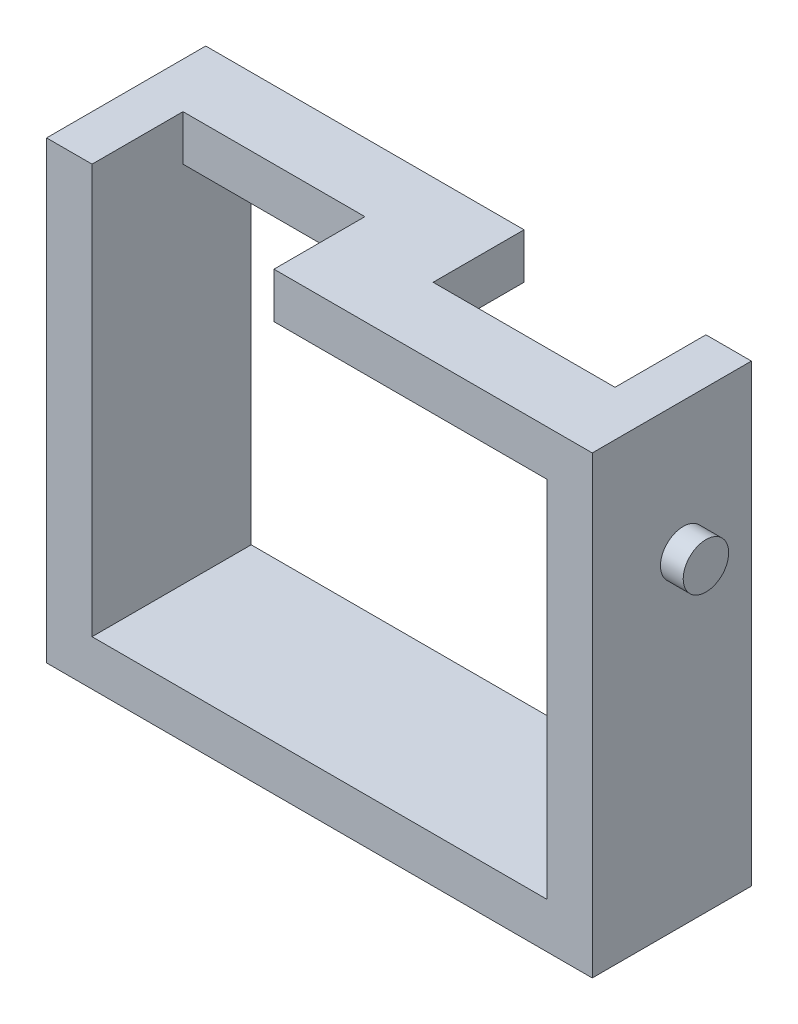
ISO-10303-21;
HEADER;
FILE_DESCRIPTION(('STEP AP214'),'2;1');
FILE_NAME('part.step','',(''),(''),'','','');
FILE_SCHEMA(('AUTOMOTIVE_DESIGN { 1 0 10303 214 1 1 1 1 }'));
ENDSEC;
DATA;
#1=APPLICATION_CONTEXT('core data for automotive mechanical design processes');
#2=APPLICATION_PROTOCOL_DEFINITION('international standard','automotive_design',2000,#1);
#3=PRODUCT_CONTEXT('',#1,'mechanical');
#4=PRODUCT('Part','Part','',(#3));
#5=PRODUCT_RELATED_PRODUCT_CATEGORY('part','',(#4));
#6=PRODUCT_DEFINITION_FORMATION('','',#4);
#7=PRODUCT_DEFINITION_CONTEXT('part definition',#1,'design');
#8=PRODUCT_DEFINITION('design','',#6,#7);
#9=PRODUCT_DEFINITION_SHAPE('','',#8);
#10=(LENGTH_UNIT() NAMED_UNIT(*) SI_UNIT(.MILLI.,.METRE.));
#11=(NAMED_UNIT(*) PLANE_ANGLE_UNIT() SI_UNIT($,.RADIAN.));
#12=(NAMED_UNIT(*) SI_UNIT($,.STERADIAN.) SOLID_ANGLE_UNIT());
#13=UNCERTAINTY_MEASURE_WITH_UNIT(LENGTH_MEASURE(1.E-05),#10,'distance_accuracy_value','');
#14=(GEOMETRIC_REPRESENTATION_CONTEXT(3) GLOBAL_UNCERTAINTY_ASSIGNED_CONTEXT((#13)) GLOBAL_UNIT_ASSIGNED_CONTEXT((#10,
#11,#12)) REPRESENTATION_CONTEXT('',''));
#15=CARTESIAN_POINT('',(0.,0.,0.));
#16=DIRECTION('',(0.,0.,1.));
#17=DIRECTION('',(1.,0.,0.));
#18=AXIS2_PLACEMENT_3D('',#15,#16,#17);
#19=CARTESIAN_POINT('',(-26.9852941176471,14.1544117647059,30.));
#20=DIRECTION('',(1.,0.,0.));
#21=DIRECTION('',(0.,1.,0.));
#22=AXIS2_PLACEMENT_3D('',#19,#20,#21);
#23=PLANE('',#22);
#24=CARTESIAN_POINT('',(-26.9852941176471,-0.345588235294112,20.));
#25=DIRECTION('',(1.,0.,0.));
#26=DIRECTION('',(0.,1.,0.));
#27=AXIS2_PLACEMENT_3D('',#24,#25,#26);
#28=CIRCLE('',#27,2.5);
#29=CARTESIAN_POINT('',(-26.9852941176471,2.15441176470589,20.));
#30=VERTEX_POINT('',#29);
#31=EDGE_CURVE('E11',#30,#30,#28,.F.);
#32=ORIENTED_EDGE('',*,*,#31,.F.);
#33=EDGE_LOOP('',(#32));
#34=FACE_BOUND('',#33,.T.);
#35=DIRECTION('',(0.,0.,-1.));
#36=VECTOR('',#35,1.);
#37=CARTESIAN_POINT('',(-26.9852941176471,14.1544117647059,30.));
#38=LINE('',#37,#36);
#39=CARTESIAN_POINT('',(-26.9852941176471,14.1544117647059,30.));
#40=VERTEX_POINT('',#39);
#41=CARTESIAN_POINT('',(-26.9852941176471,14.1544117647059,12.5));
#42=VERTEX_POINT('',#41);
#43=EDGE_CURVE('E156',#40,#42,#38,.T.);
#44=ORIENTED_EDGE('',*,*,#43,.T.);
#45=DIRECTION('',(0.,-1.,0.));
#46=VECTOR('',#45,1.);
#47=CARTESIAN_POINT('',(-26.9852941176471,14.1544117647059,12.5));
#48=LINE('',#47,#46);
#49=CARTESIAN_POINT('',(-26.9852941176471,-35.8455882352941,12.5));
#50=VERTEX_POINT('',#49);
#51=EDGE_CURVE('E138',#42,#50,#48,.T.);
#52=ORIENTED_EDGE('',*,*,#51,.T.);
#53=DIRECTION('',(0.,0.,-1.));
#54=VECTOR('',#53,1.);
#55=CARTESIAN_POINT('',(-26.9852941176471,-35.8455882352941,30.));
#56=LINE('',#55,#54);
#57=CARTESIAN_POINT('',(-26.9852941176471,-35.8455882352941,30.));
#58=VERTEX_POINT('',#57);
#59=EDGE_CURVE('E181',#58,#50,#56,.T.);
#60=ORIENTED_EDGE('',*,*,#59,.F.);
#61=DIRECTION('',(0.,-1.,0.));
#62=VECTOR('',#61,1.);
#63=CARTESIAN_POINT('',(-26.9852941176471,14.1544117647059,30.));
#64=LINE('',#63,#62);
#65=EDGE_CURVE('E164',#40,#58,#64,.T.);
#66=ORIENTED_EDGE('',*,*,#65,.F.);
#67=EDGE_LOOP('',(#44,#52,#60,#66));
#68=FACE_BOUND('',#67,.T.);
#69=ADVANCED_FACE('F39',(#34,#68),#23,.F.);
#70=CARTESIAN_POINT('',(-26.9852941176471,-35.8455882352941,30.));
#71=DIRECTION('',(0.,1.,0.));
#72=DIRECTION('',(0.,0.,1.));
#73=AXIS2_PLACEMENT_3D('',#70,#71,#72);
#74=PLANE('',#73);
#75=ORIENTED_EDGE('',*,*,#59,.T.);
#76=DIRECTION('',(1.,0.,0.));
#77=VECTOR('',#76,1.);
#78=CARTESIAN_POINT('',(-28.3531366312246,-35.8455882352941,12.5));
#79=LINE('',#78,#77);
#80=CARTESIAN_POINT('',(33.0147058823529,-35.8455882352941,12.5));
#81=VERTEX_POINT('',#80);
#82=EDGE_CURVE('E141',#50,#81,#79,.T.);
#83=ORIENTED_EDGE('',*,*,#82,.T.);
#84=DIRECTION('',(0.,0.,-1.));
#85=VECTOR('',#84,1.);
#86=CARTESIAN_POINT('',(33.0147058823529,-35.8455882352941,30.));
#87=LINE('',#86,#85);
#88=CARTESIAN_POINT('',(33.0147058823529,-35.8455882352941,30.));
#89=VERTEX_POINT('',#88);
#90=EDGE_CURVE('E171',#89,#81,#87,.T.);
#91=ORIENTED_EDGE('',*,*,#90,.F.);
#92=DIRECTION('',(1.,0.,0.));
#93=VECTOR('',#92,1.);
#94=CARTESIAN_POINT('',(-26.9852941176471,-35.8455882352941,30.));
#95=LINE('',#94,#93);
#96=EDGE_CURVE('E211',#58,#89,#95,.T.);
#97=ORIENTED_EDGE('',*,*,#96,.F.);
#98=EDGE_LOOP('',(#75,#83,#91,#97));
#99=FACE_BOUND('',#98,.T.);
#100=ADVANCED_FACE('F203',(#99),#74,.F.);
#101=CARTESIAN_POINT('',(33.0147058823529,14.1544117647059,30.));
#102=DIRECTION('',(-1.,0.,0.));
#103=DIRECTION('',(0.,0.,1.));
#104=AXIS2_PLACEMENT_3D('',#101,#102,#103);
#105=PLANE('',#104);
#106=CARTESIAN_POINT('',(33.0147058823529,-0.345588235294111,20.));
#107=DIRECTION('',(-1.,0.,0.));
#108=DIRECTION('',(0.,0.,1.));
#109=AXIS2_PLACEMENT_3D('',#106,#107,#108);
#110=CIRCLE('',#109,2.5);
#111=CARTESIAN_POINT('',(33.0147058823529,-0.345588235294111,22.5));
#112=VERTEX_POINT('',#111);
#113=EDGE_CURVE('E47',#112,#112,#110,.F.);
#114=ORIENTED_EDGE('',*,*,#113,.F.);
#115=EDGE_LOOP('',(#114));
#116=FACE_BOUND('',#115,.T.);
#117=ORIENTED_EDGE('',*,*,#90,.T.);
#118=DIRECTION('',(0.,1.,0.));
#119=VECTOR('',#118,1.);
#120=CARTESIAN_POINT('',(33.0147058823529,14.1544117647059,12.5));
#121=LINE('',#120,#119);
#122=CARTESIAN_POINT('',(33.0147058823529,14.1544117647059,12.5));
#123=VERTEX_POINT('',#122);
#124=EDGE_CURVE('E148',#81,#123,#121,.T.);
#125=ORIENTED_EDGE('',*,*,#124,.T.);
#126=DIRECTION('',(0.,0.,-1.));
#127=VECTOR('',#126,1.);
#128=CARTESIAN_POINT('',(33.0147058823529,14.1544117647059,30.));
#129=LINE('',#128,#127);
#130=CARTESIAN_POINT('',(33.0147058823529,14.1544117647059,30.));
#131=VERTEX_POINT('',#130);
#132=EDGE_CURVE('E166',#131,#123,#129,.T.);
#133=ORIENTED_EDGE('',*,*,#132,.F.);
#134=DIRECTION('',(0.,1.,0.));
#135=VECTOR('',#134,1.);
#136=CARTESIAN_POINT('',(33.0147058823529,14.1544117647059,30.));
#137=LINE('',#136,#135);
#138=EDGE_CURVE('E209',#89,#131,#137,.T.);
#139=ORIENTED_EDGE('',*,*,#138,.F.);
#140=EDGE_LOOP('',(#117,#125,#133,#139));
#141=FACE_BOUND('',#140,.T.);
#142=ADVANCED_FACE('F200',(#116,#141),#105,.F.);
#143=CARTESIAN_POINT('',(-26.9852941176471,14.1544117647059,30.));
#144=DIRECTION('',(0.,-1.,0.));
#145=DIRECTION('',(0.,0.,-1.));
#146=AXIS2_PLACEMENT_3D('',#143,#144,#145);
#147=PLANE('',#146);
#148=ORIENTED_EDGE('',*,*,#132,.T.);
#149=DIRECTION('',(1.,0.,0.));
#150=VECTOR('',#149,1.);
#151=CARTESIAN_POINT('',(-28.3531366312246,14.1544117647059,12.5));
#152=LINE('',#151,#150);
#153=CARTESIAN_POINT('',(28.0147058823529,14.1544117647059,12.5));
#154=VERTEX_POINT('',#153);
#155=EDGE_CURVE('E161',#154,#123,#152,.T.);
#156=ORIENTED_EDGE('',*,*,#155,.F.);
#157=DIRECTION('',(0.,0.,-1.));
#158=VECTOR('',#157,1.);
#159=CARTESIAN_POINT('',(28.0147058823529,14.1544117647059,0.));
#160=LINE('',#159,#158);
#161=CARTESIAN_POINT('',(28.0147058823529,14.1544117647059,22.5));
#162=VERTEX_POINT('',#161);
#163=EDGE_CURVE('E259',#162,#154,#160,.T.);
#164=ORIENTED_EDGE('',*,*,#163,.F.);
#165=DIRECTION('',(1.,0.,0.));
#166=VECTOR('',#165,1.);
#167=CARTESIAN_POINT('',(8.01470588235294,14.1544117647059,22.5));
#168=LINE('',#167,#166);
#169=CARTESIAN_POINT('',(8.01470588235294,14.1544117647059,22.5));
#170=VERTEX_POINT('',#169);
#171=EDGE_CURVE('E266',#170,#162,#168,.T.);
#172=ORIENTED_EDGE('',*,*,#171,.F.);
#173=DIRECTION('',(0.,0.,1.));
#174=VECTOR('',#173,1.);
#175=CARTESIAN_POINT('',(8.01470588235294,14.1544117647059,0.));
#176=LINE('',#175,#174);
#177=CARTESIAN_POINT('',(8.01470588235294,14.1544117647059,12.5));
#178=VERTEX_POINT('',#177);
#179=EDGE_CURVE('E159',#178,#170,#176,.T.);
#180=ORIENTED_EDGE('',*,*,#179,.F.);
#181=EDGE_CURVE('E54',#42,#178,#152,.T.);
#182=ORIENTED_EDGE('',*,*,#181,.F.);
#183=ORIENTED_EDGE('',*,*,#43,.F.);
#184=DIRECTION('',(-1.,0.,0.));
#185=VECTOR('',#184,1.);
#186=CARTESIAN_POINT('',(-26.9852941176471,14.1544117647059,30.));
#187=LINE('',#186,#185);
#188=CARTESIAN_POINT('',(-21.9852941176471,14.1544117647059,30.));
#189=VERTEX_POINT('',#188);
#190=EDGE_CURVE('E174',#189,#40,#187,.T.);
#191=ORIENTED_EDGE('',*,*,#190,.F.);
#192=DIRECTION('',(0.,0.,1.));
#193=VECTOR('',#192,1.);
#194=CARTESIAN_POINT('',(-21.9852941176471,14.1544117647059,30.));
#195=LINE('',#194,#193);
#196=CARTESIAN_POINT('',(-21.9852941176471,14.1544117647059,20.));
#197=VERTEX_POINT('',#196);
#198=EDGE_CURVE('E147',#197,#189,#195,.T.);
#199=ORIENTED_EDGE('',*,*,#198,.F.);
#200=DIRECTION('',(-1.,0.,0.));
#201=VECTOR('',#200,1.);
#202=CARTESIAN_POINT('',(-21.9852941176471,14.1544117647059,20.));
#203=LINE('',#202,#201);
#204=CARTESIAN_POINT('',(-1.98529411764706,14.1544117647059,20.));
#205=VERTEX_POINT('',#204);
#206=EDGE_CURVE('E243',#205,#197,#203,.T.);
#207=ORIENTED_EDGE('',*,*,#206,.F.);
#208=DIRECTION('',(0.,0.,-1.));
#209=VECTOR('',#208,1.);
#210=CARTESIAN_POINT('',(-1.98529411764706,14.1544117647059,30.));
#211=LINE('',#210,#209);
#212=CARTESIAN_POINT('',(-1.98529411764706,14.1544117647059,30.));
#213=VERTEX_POINT('',#212);
#214=EDGE_CURVE('E240',#213,#205,#211,.T.);
#215=ORIENTED_EDGE('',*,*,#214,.F.);
#216=EDGE_CURVE('E167',#131,#213,#187,.T.);
#217=ORIENTED_EDGE('',*,*,#216,.F.);
#218=EDGE_LOOP('',(#148,#156,#164,#172,#180,#182,#183,#191,#199,#207,#215,#217));
#219=FACE_BOUND('',#218,.T.);
#220=ADVANCED_FACE('F154',(#219),#147,.F.);
#221=CARTESIAN_POINT('',(0.,0.,30.));
#222=DIRECTION('',(0.,0.,1.));
#223=DIRECTION('',(1.,0.,0.));
#224=AXIS2_PLACEMENT_3D('',#221,#222,#223);
#225=PLANE('',#224);
#226=DIRECTION('',(0.,-1.,0.));
#227=VECTOR('',#226,1.);
#228=CARTESIAN_POINT('',(-21.9852941176471,9.15441176470589,30.));
#229=LINE('',#228,#227);
#230=CARTESIAN_POINT('',(-21.9852941176471,-30.8455882352941,30.));
#231=VERTEX_POINT('',#230);
#232=EDGE_CURVE('E276',#189,#231,#229,.T.);
#233=ORIENTED_EDGE('',*,*,#232,.F.);
#234=ORIENTED_EDGE('',*,*,#190,.T.);
#235=ORIENTED_EDGE('',*,*,#65,.T.);
#236=ORIENTED_EDGE('',*,*,#96,.T.);
#237=ORIENTED_EDGE('',*,*,#138,.T.);
#238=ORIENTED_EDGE('',*,*,#216,.T.);
#239=DIRECTION('',(0.,1.,0.));
#240=VECTOR('',#239,1.);
#241=CARTESIAN_POINT('',(-1.98529411764706,4.15441176470589,30.));
#242=LINE('',#241,#240);
#243=CARTESIAN_POINT('',(-1.98529411764706,9.15441176470589,30.));
#244=VERTEX_POINT('',#243);
#245=EDGE_CURVE('E247',#244,#213,#242,.T.);
#246=ORIENTED_EDGE('',*,*,#245,.F.);
#247=DIRECTION('',(-1.,0.,0.));
#248=VECTOR('',#247,1.);
#249=CARTESIAN_POINT('',(-21.9852941176471,9.15441176470589,30.));
#250=LINE('',#249,#248);
#251=CARTESIAN_POINT('',(28.0147058823529,9.15441176470589,30.));
#252=VERTEX_POINT('',#251);
#253=EDGE_CURVE('E291',#252,#244,#250,.T.);
#254=ORIENTED_EDGE('',*,*,#253,.F.);
#255=DIRECTION('',(0.,1.,0.));
#256=VECTOR('',#255,1.);
#257=CARTESIAN_POINT('',(28.0147058823529,9.15441176470589,30.));
#258=LINE('',#257,#256);
#259=CARTESIAN_POINT('',(28.014705882353,-30.8455882352941,30.));
#260=VERTEX_POINT('',#259);
#261=EDGE_CURVE('E287',#260,#252,#258,.T.);
#262=ORIENTED_EDGE('',*,*,#261,.F.);
#263=DIRECTION('',(1.,0.,0.));
#264=VECTOR('',#263,1.);
#265=CARTESIAN_POINT('',(-21.9852941176471,-30.8455882352941,30.));
#266=LINE('',#265,#264);
#267=EDGE_CURVE('E283',#231,#260,#266,.T.);
#268=ORIENTED_EDGE('',*,*,#267,.F.);
#269=EDGE_LOOP('',(#233,#234,#235,#236,#237,#238,#246,#254,#262,#268));
#270=FACE_BOUND('',#269,.T.);
#271=ADVANCED_FACE('F313',(#270),#225,.T.);
#272=CARTESIAN_POINT('',(-21.9852941176471,9.15441176470589,0.));
#273=DIRECTION('',(-1.,0.,0.));
#274=DIRECTION('',(0.,-1.,0.));
#275=AXIS2_PLACEMENT_3D('',#272,#273,#274);
#276=PLANE('',#275);
#277=DIRECTION('',(0.,0.,1.));
#278=VECTOR('',#277,1.);
#279=CARTESIAN_POINT('',(-21.9852941176471,-30.8455882352941,0.));
#280=LINE('',#279,#278);
#281=CARTESIAN_POINT('',(-21.9852941176471,-30.8455882352941,12.5));
#282=VERTEX_POINT('',#281);
#283=EDGE_CURVE('E295',#282,#231,#280,.T.);
#284=ORIENTED_EDGE('',*,*,#283,.F.);
#285=DIRECTION('',(0.,1.,0.));
#286=VECTOR('',#285,1.);
#287=CARTESIAN_POINT('',(-21.9852941176471,9.15441176470589,12.5));
#288=LINE('',#287,#286);
#289=CARTESIAN_POINT('',(-21.9852941176471,9.15441176470589,12.5));
#290=VERTEX_POINT('',#289);
#291=EDGE_CURVE('E217',#282,#290,#288,.T.);
#292=ORIENTED_EDGE('',*,*,#291,.T.);
#293=DIRECTION('',(0.,0.,1.));
#294=VECTOR('',#293,1.);
#295=CARTESIAN_POINT('',(-21.9852941176471,9.15441176470589,0.));
#296=LINE('',#295,#294);
#297=CARTESIAN_POINT('',(-21.9852941176471,9.15441176470589,20.));
#298=VERTEX_POINT('',#297);
#299=EDGE_CURVE('E296',#290,#298,#296,.T.);
#300=ORIENTED_EDGE('',*,*,#299,.T.);
#301=DIRECTION('',(0.,1.,0.));
#302=VECTOR('',#301,1.);
#303=CARTESIAN_POINT('',(-21.9852941176471,4.15441176470589,20.));
#304=LINE('',#303,#302);
#305=EDGE_CURVE('E248',#298,#197,#304,.T.);
#306=ORIENTED_EDGE('',*,*,#305,.T.);
#307=ORIENTED_EDGE('',*,*,#198,.T.);
#308=ORIENTED_EDGE('',*,*,#232,.T.);
#309=EDGE_LOOP('',(#284,#292,#300,#306,#307,#308));
#310=FACE_BOUND('',#309,.T.);
#311=ADVANCED_FACE('F320',(#310),#276,.F.);
#312=CARTESIAN_POINT('',(-21.9852941176471,9.15441176470589,0.));
#313=DIRECTION('',(0.,1.,0.));
#314=DIRECTION('',(0.,0.,1.));
#315=AXIS2_PLACEMENT_3D('',#312,#313,#314);
#316=PLANE('',#315);
#317=ORIENTED_EDGE('',*,*,#299,.F.);
#318=DIRECTION('',(1.,0.,0.));
#319=VECTOR('',#318,1.);
#320=CARTESIAN_POINT('',(-21.9852941176471,9.15441176470589,12.5));
#321=LINE('',#320,#319);
#322=CARTESIAN_POINT('',(8.01470588235294,9.15441176470589,12.5));
#323=VERTEX_POINT('',#322);
#324=EDGE_CURVE('E213',#290,#323,#321,.T.);
#325=ORIENTED_EDGE('',*,*,#324,.T.);
#326=DIRECTION('',(0.,0.,1.));
#327=VECTOR('',#326,1.);
#328=CARTESIAN_POINT('',(8.01470588235294,9.15441176470589,0.));
#329=LINE('',#328,#327);
#330=CARTESIAN_POINT('',(8.01470588235294,9.15441176470589,22.5));
#331=VERTEX_POINT('',#330);
#332=EDGE_CURVE('E255',#323,#331,#329,.T.);
#333=ORIENTED_EDGE('',*,*,#332,.T.);
#334=DIRECTION('',(1.,0.,0.));
#335=VECTOR('',#334,1.);
#336=CARTESIAN_POINT('',(8.01470588235294,9.15441176470589,22.5));
#337=LINE('',#336,#335);
#338=CARTESIAN_POINT('',(28.0147058823529,9.15441176470589,22.5));
#339=VERTEX_POINT('',#338);
#340=EDGE_CURVE('E258',#331,#339,#337,.T.);
#341=ORIENTED_EDGE('',*,*,#340,.T.);
#342=DIRECTION('',(0.,0.,1.));
#343=VECTOR('',#342,1.);
#344=CARTESIAN_POINT('',(28.0147058823529,9.15441176470589,0.));
#345=LINE('',#344,#343);
#346=EDGE_CURVE('E299',#339,#252,#345,.T.);
#347=ORIENTED_EDGE('',*,*,#346,.T.);
#348=ORIENTED_EDGE('',*,*,#253,.T.);
#349=DIRECTION('',(0.,0.,-1.));
#350=VECTOR('',#349,1.);
#351=CARTESIAN_POINT('',(-1.98529411764706,9.15441176470589,0.));
#352=LINE('',#351,#350);
#353=CARTESIAN_POINT('',(-1.98529411764706,9.15441176470589,20.));
#354=VERTEX_POINT('',#353);
#355=EDGE_CURVE('E184',#244,#354,#352,.T.);
#356=ORIENTED_EDGE('',*,*,#355,.T.);
#357=DIRECTION('',(-1.,0.,0.));
#358=VECTOR('',#357,1.);
#359=CARTESIAN_POINT('',(-21.9852941176471,9.15441176470589,20.));
#360=LINE('',#359,#358);
#361=EDGE_CURVE('E188',#354,#298,#360,.T.);
#362=ORIENTED_EDGE('',*,*,#361,.T.);
#363=EDGE_LOOP('',(#317,#325,#333,#341,#347,#348,#356,#362));
#364=FACE_BOUND('',#363,.T.);
#365=ADVANCED_FACE('F331',(#364),#316,.F.);
#366=CARTESIAN_POINT('',(28.0147058823529,9.15441176470589,0.));
#367=DIRECTION('',(1.,0.,0.));
#368=DIRECTION('',(0.,1.,0.));
#369=AXIS2_PLACEMENT_3D('',#366,#367,#368);
#370=PLANE('',#369);
#371=ORIENTED_EDGE('',*,*,#163,.T.);
#372=DIRECTION('',(0.,-1.,0.));
#373=VECTOR('',#372,1.);
#374=CARTESIAN_POINT('',(28.0147058823529,9.15441176470589,12.5));
#375=LINE('',#374,#373);
#376=CARTESIAN_POINT('',(28.014705882353,-30.8455882352941,12.5));
#377=VERTEX_POINT('',#376);
#378=EDGE_CURVE('E231',#154,#377,#375,.T.);
#379=ORIENTED_EDGE('',*,*,#378,.T.);
#380=DIRECTION('',(0.,0.,1.));
#381=VECTOR('',#380,1.);
#382=CARTESIAN_POINT('',(28.014705882353,-30.8455882352941,0.));
#383=LINE('',#382,#381);
#384=EDGE_CURVE('E302',#377,#260,#383,.T.);
#385=ORIENTED_EDGE('',*,*,#384,.T.);
#386=ORIENTED_EDGE('',*,*,#261,.T.);
#387=ORIENTED_EDGE('',*,*,#346,.F.);
#388=DIRECTION('',(0.,1.,0.));
#389=VECTOR('',#388,1.);
#390=CARTESIAN_POINT('',(28.0147058823529,9.15441176470589,22.5));
#391=LINE('',#390,#389);
#392=EDGE_CURVE('E273',#339,#162,#391,.T.);
#393=ORIENTED_EDGE('',*,*,#392,.T.);
#394=EDGE_LOOP('',(#371,#379,#385,#386,#387,#393));
#395=FACE_BOUND('',#394,.T.);
#396=ADVANCED_FACE('F335',(#395),#370,.F.);
#397=CARTESIAN_POINT('',(-21.9852941176471,-30.8455882352941,0.));
#398=DIRECTION('',(0.,-1.,0.));
#399=DIRECTION('',(1.,0.,0.));
#400=AXIS2_PLACEMENT_3D('',#397,#398,#399);
#401=PLANE('',#400);
#402=ORIENTED_EDGE('',*,*,#384,.F.);
#403=DIRECTION('',(-1.,0.,0.));
#404=VECTOR('',#403,1.);
#405=CARTESIAN_POINT('',(-21.9852941176471,-30.8455882352941,12.5));
#406=LINE('',#405,#404);
#407=EDGE_CURVE('E227',#377,#282,#406,.T.);
#408=ORIENTED_EDGE('',*,*,#407,.T.);
#409=ORIENTED_EDGE('',*,*,#283,.T.);
#410=ORIENTED_EDGE('',*,*,#267,.T.);
#411=EDGE_LOOP('',(#402,#408,#409,#410));
#412=FACE_BOUND('',#411,.T.);
#413=ADVANCED_FACE('F338',(#412),#401,.F.);
#414=CARTESIAN_POINT('',(8.01470588235294,9.15441176470589,0.));
#415=DIRECTION('',(-1.,0.,0.));
#416=DIRECTION('',(0.,0.,1.));
#417=AXIS2_PLACEMENT_3D('',#414,#415,#416);
#418=PLANE('',#417);
#419=ORIENTED_EDGE('',*,*,#332,.F.);
#420=DIRECTION('',(0.,1.,0.));
#421=VECTOR('',#420,1.);
#422=CARTESIAN_POINT('',(8.01470588235294,9.15441176470589,12.5));
#423=LINE('',#422,#421);
#424=EDGE_CURVE('E192',#323,#178,#423,.T.);
#425=ORIENTED_EDGE('',*,*,#424,.T.);
#426=ORIENTED_EDGE('',*,*,#179,.T.);
#427=DIRECTION('',(0.,1.,0.));
#428=VECTOR('',#427,1.);
#429=CARTESIAN_POINT('',(8.01470588235294,9.15441176470589,22.5));
#430=LINE('',#429,#428);
#431=EDGE_CURVE('E263',#331,#170,#430,.T.);
#432=ORIENTED_EDGE('',*,*,#431,.F.);
#433=EDGE_LOOP('',(#419,#425,#426,#432));
#434=FACE_BOUND('',#433,.T.);
#435=ADVANCED_FACE('F342',(#434),#418,.F.);
#436=CARTESIAN_POINT('',(8.01470588235294,9.15441176470589,22.5));
#437=DIRECTION('',(0.,0.,1.));
#438=DIRECTION('',(1.,0.,0.));
#439=AXIS2_PLACEMENT_3D('',#436,#437,#438);
#440=PLANE('',#439);
#441=ORIENTED_EDGE('',*,*,#171,.T.);
#442=ORIENTED_EDGE('',*,*,#392,.F.);
#443=ORIENTED_EDGE('',*,*,#340,.F.);
#444=ORIENTED_EDGE('',*,*,#431,.T.);
#445=EDGE_LOOP('',(#441,#442,#443,#444));
#446=FACE_BOUND('',#445,.T.);
#447=ADVANCED_FACE('F344',(#446),#440,.F.);
#448=CARTESIAN_POINT('',(-21.9852941176471,4.15441176470589,20.));
#449=DIRECTION('',(0.,0.,-1.));
#450=DIRECTION('',(-1.,0.,0.));
#451=AXIS2_PLACEMENT_3D('',#448,#449,#450);
#452=PLANE('',#451);
#453=DIRECTION('',(0.,1.,0.));
#454=VECTOR('',#453,1.);
#455=CARTESIAN_POINT('',(-1.98529411764706,4.15441176470589,20.));
#456=LINE('',#455,#454);
#457=EDGE_CURVE('E62',#354,#205,#456,.T.);
#458=ORIENTED_EDGE('',*,*,#457,.T.);
#459=ORIENTED_EDGE('',*,*,#206,.T.);
#460=ORIENTED_EDGE('',*,*,#305,.F.);
#461=ORIENTED_EDGE('',*,*,#361,.F.);
#462=EDGE_LOOP('',(#458,#459,#460,#461));
#463=FACE_BOUND('',#462,.T.);
#464=ADVANCED_FACE('F324',(#463),#452,.F.);
#465=CARTESIAN_POINT('',(-1.98529411764706,4.15441176470589,30.));
#466=DIRECTION('',(1.,0.,0.));
#467=DIRECTION('',(0.,0.,-1.));
#468=AXIS2_PLACEMENT_3D('',#465,#466,#467);
#469=PLANE('',#468);
#470=ORIENTED_EDGE('',*,*,#245,.T.);
#471=ORIENTED_EDGE('',*,*,#214,.T.);
#472=ORIENTED_EDGE('',*,*,#457,.F.);
#473=ORIENTED_EDGE('',*,*,#355,.F.);
#474=EDGE_LOOP('',(#470,#471,#472,#473));
#475=FACE_BOUND('',#474,.T.);
#476=ADVANCED_FACE('F325',(#475),#469,.F.);
#477=CARTESIAN_POINT('',(-28.3531366312246,-35.8455882352941,12.5));
#478=DIRECTION('',(0.,0.,1.));
#479=DIRECTION('',(1.,0.,0.));
#480=AXIS2_PLACEMENT_3D('',#477,#478,#479);
#481=PLANE('',#480);
#482=ORIENTED_EDGE('',*,*,#181,.T.);
#483=ORIENTED_EDGE('',*,*,#424,.F.);
#484=ORIENTED_EDGE('',*,*,#324,.F.);
#485=ORIENTED_EDGE('',*,*,#291,.F.);
#486=ORIENTED_EDGE('',*,*,#407,.F.);
#487=ORIENTED_EDGE('',*,*,#378,.F.);
#488=ORIENTED_EDGE('',*,*,#155,.T.);
#489=ORIENTED_EDGE('',*,*,#124,.F.);
#490=ORIENTED_EDGE('',*,*,#82,.F.);
#491=ORIENTED_EDGE('',*,*,#51,.F.);
#492=EDGE_LOOP('',(#482,#483,#484,#485,#486,#487,#488,#489,#490,#491));
#493=FACE_BOUND('',#492,.T.);
#494=ADVANCED_FACE('F139',(#493),#481,.F.);
#495=CARTESIAN_POINT('',(35.5147058823529,-0.345588235294111,20.));
#496=DIRECTION('',(-1.,0.,0.));
#497=DIRECTION('',(0.,0.,1.));
#498=AXIS2_PLACEMENT_3D('',#495,#496,#497);
#499=CYLINDRICAL_SURFACE('',#498,2.5);
#500=CARTESIAN_POINT('',(35.5147058823529,-0.345588235294111,20.));
#501=DIRECTION('',(1.,0.,0.));
#502=DIRECTION('',(0.,0.,-1.));
#503=AXIS2_PLACEMENT_3D('',#500,#501,#502);
#504=CIRCLE('',#503,2.5);
#505=CARTESIAN_POINT('',(35.5147058823529,-0.345588235294111,17.5));
#506=VERTEX_POINT('',#505);
#507=EDGE_CURVE('E220',#506,#506,#504,.T.);
#508=ORIENTED_EDGE('',*,*,#507,.F.);
#509=EDGE_LOOP('',(#508));
#510=FACE_BOUND('',#509,.T.);
#511=ORIENTED_EDGE('',*,*,#113,.T.);
#512=EDGE_LOOP('',(#511));
#513=FACE_BOUND('',#512,.T.);
#514=ADVANCED_FACE('F198',(#510,#513),#499,.T.);
#515=CARTESIAN_POINT('',(35.5147058823529,-0.345588235294111,20.));
#516=DIRECTION('',(1.,0.,0.));
#517=DIRECTION('',(0.,0.,-1.));
#518=AXIS2_PLACEMENT_3D('',#515,#516,#517);
#519=PLANE('',#518);
#520=ORIENTED_EDGE('',*,*,#507,.T.);
#521=EDGE_LOOP('',(#520));
#522=FACE_BOUND('',#521,.T.);
#523=ADVANCED_FACE('F366',(#522),#519,.T.);
#524=CARTESIAN_POINT('',(-29.4852941176471,-0.345588235294112,20.));
#525=DIRECTION('',(1.,0.,0.));
#526=DIRECTION('',(0.,1.,0.));
#527=AXIS2_PLACEMENT_3D('',#524,#525,#526);
#528=CYLINDRICAL_SURFACE('',#527,2.5);
#529=CARTESIAN_POINT('',(-29.4852941176471,-0.345588235294112,20.));
#530=DIRECTION('',(-1.,0.,0.));
#531=DIRECTION('',(0.,-1.,0.));
#532=AXIS2_PLACEMENT_3D('',#529,#530,#531);
#533=CIRCLE('',#532,2.5);
#534=CARTESIAN_POINT('',(-29.4852941176471,-2.84558823529411,20.));
#535=VERTEX_POINT('',#534);
#536=EDGE_CURVE('E507',#535,#535,#533,.T.);
#537=ORIENTED_EDGE('',*,*,#536,.F.);
#538=EDGE_LOOP('',(#537));
#539=FACE_BOUND('',#538,.T.);
#540=ORIENTED_EDGE('',*,*,#31,.T.);
#541=EDGE_LOOP('',(#540));
#542=FACE_BOUND('',#541,.T.);
#543=ADVANCED_FACE('F363',(#539,#542),#528,.T.);
#544=CARTESIAN_POINT('',(-29.4852941176471,-0.345588235294112,20.));
#545=DIRECTION('',(-1.,0.,0.));
#546=DIRECTION('',(0.,-1.,0.));
#547=AXIS2_PLACEMENT_3D('',#544,#545,#546);
#548=PLANE('',#547);
#549=ORIENTED_EDGE('',*,*,#536,.T.);
#550=EDGE_LOOP('',(#549));
#551=FACE_BOUND('',#550,.T.);
#552=ADVANCED_FACE('F365',(#551),#548,.T.);
#553=CLOSED_SHELL('',(#69,#100,#142,#220,#271,#311,#365,#396,#413,#435,#447,#464,#476,#494,#514,
#523,#543,#552));
#554=MANIFOLD_SOLID_BREP('B2',#553);
#555=ADVANCED_BREP_SHAPE_REPRESENTATION('',(#18,#554),#14);
#556=SHAPE_DEFINITION_REPRESENTATION(#9,#555);
ENDSEC;
END-ISO-10303-21;
